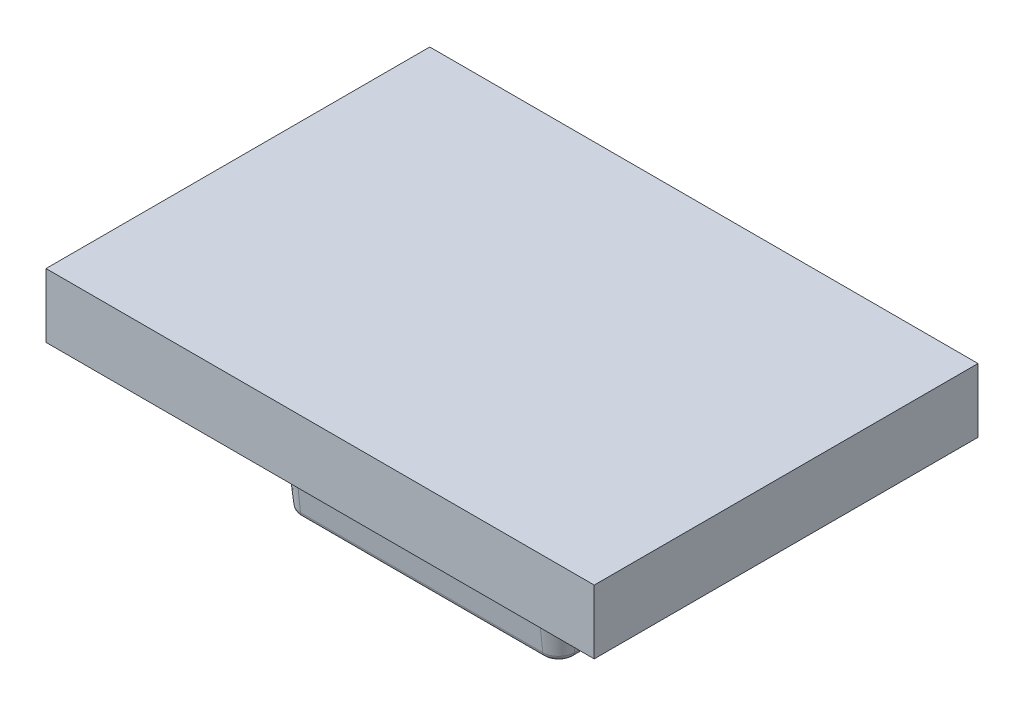
ISO-10303-21;
HEADER;
FILE_DESCRIPTION(('STEP AP214'),'2;1');
FILE_NAME('part.step','',(''),(''),'','','');
FILE_SCHEMA(('AUTOMOTIVE_DESIGN { 1 0 10303 214 1 1 1 1 }'));
ENDSEC;
DATA;
#1=APPLICATION_CONTEXT('core data for automotive mechanical design processes');
#2=APPLICATION_PROTOCOL_DEFINITION('international standard','automotive_design',2000,#1);
#3=PRODUCT_CONTEXT('',#1,'mechanical');
#4=PRODUCT('Part','Part','',(#3));
#5=PRODUCT_RELATED_PRODUCT_CATEGORY('part','',(#4));
#6=PRODUCT_DEFINITION_FORMATION('','',#4);
#7=PRODUCT_DEFINITION_CONTEXT('part definition',#1,'design');
#8=PRODUCT_DEFINITION('design','',#6,#7);
#9=PRODUCT_DEFINITION_SHAPE('','',#8);
#10=(LENGTH_UNIT() NAMED_UNIT(*) SI_UNIT(.MILLI.,.METRE.));
#11=(NAMED_UNIT(*) PLANE_ANGLE_UNIT() SI_UNIT($,.RADIAN.));
#12=(NAMED_UNIT(*) SI_UNIT($,.STERADIAN.) SOLID_ANGLE_UNIT());
#13=UNCERTAINTY_MEASURE_WITH_UNIT(LENGTH_MEASURE(1.E-05),#10,'distance_accuracy_value','');
#14=(GEOMETRIC_REPRESENTATION_CONTEXT(3) GLOBAL_UNCERTAINTY_ASSIGNED_CONTEXT((#13)) GLOBAL_UNIT_ASSIGNED_CONTEXT((#10,
#11,#12)) REPRESENTATION_CONTEXT('',''));
#15=CARTESIAN_POINT('',(0.,0.,0.));
#16=DIRECTION('',(0.,0.,1.));
#17=DIRECTION('',(1.,0.,0.));
#18=AXIS2_PLACEMENT_3D('',#15,#16,#17);
#19=CARTESIAN_POINT('',(0.,105.801666725908,0.));
#20=DIRECTION('',(0.,-1.,0.));
#21=DIRECTION('',(0.,0.,-1.));
#22=AXIS2_PLACEMENT_3D('',#19,#20,#21);
#23=PLANE('',#22);
#24=DIRECTION('',(0.,0.,1.));
#25=VECTOR('',#24,1.);
#26=CARTESIAN_POINT('',(150.,105.801666725908,105.));
#27=LINE('',#26,#25);
#28=CARTESIAN_POINT('',(150.,105.801666725908,-105.));
#29=VERTEX_POINT('',#28);
#30=CARTESIAN_POINT('',(150.,105.801666725908,105.));
#31=VERTEX_POINT('',#30);
#32=EDGE_CURVE('E292',#29,#31,#27,.T.);
#33=ORIENTED_EDGE('',*,*,#32,.F.);
#34=DIRECTION('',(1.,0.,0.));
#35=VECTOR('',#34,1.);
#36=CARTESIAN_POINT('',(-150.,105.801666725908,-105.));
#37=LINE('',#36,#35);
#38=CARTESIAN_POINT('',(-150.,105.801666725908,-105.));
#39=VERTEX_POINT('',#38);
#40=EDGE_CURVE('E304',#39,#29,#37,.T.);
#41=ORIENTED_EDGE('',*,*,#40,.F.);
#42=DIRECTION('',(0.,0.,-1.));
#43=VECTOR('',#42,1.);
#44=CARTESIAN_POINT('',(-150.,105.801666725908,105.));
#45=LINE('',#44,#43);
#46=CARTESIAN_POINT('',(-150.,105.801666725908,105.));
#47=VERTEX_POINT('',#46);
#48=EDGE_CURVE('E300',#47,#39,#45,.T.);
#49=ORIENTED_EDGE('',*,*,#48,.F.);
#50=DIRECTION('',(-1.,0.,0.));
#51=VECTOR('',#50,1.);
#52=CARTESIAN_POINT('',(-150.,105.801666725908,105.));
#53=LINE('',#52,#51);
#54=EDGE_CURVE('E296',#31,#47,#53,.T.);
#55=ORIENTED_EDGE('',*,*,#54,.F.);
#56=EDGE_LOOP('',(#33,#41,#49,#55));
#57=FACE_BOUND('',#56,.T.);
#58=ADVANCED_FACE('F47',(#57),#23,.F.);
#59=CARTESIAN_POINT('',(-150.,105.801666725908,105.));
#60=DIRECTION('',(0.,0.,1.));
#61=DIRECTION('',(1.,0.,0.));
#62=AXIS2_PLACEMENT_3D('',#59,#60,#61);
#63=PLANE('',#62);
#64=DIRECTION('',(0.,-1.,0.));
#65=VECTOR('',#64,1.);
#66=CARTESIAN_POINT('',(-150.,105.801666725908,105.));
#67=LINE('',#66,#65);
#68=CARTESIAN_POINT('',(-150.,70.8016667259083,105.));
#69=VERTEX_POINT('',#68);
#70=EDGE_CURVE('E316',#47,#69,#67,.T.);
#71=ORIENTED_EDGE('',*,*,#70,.T.);
#72=DIRECTION('',(1.,0.,0.));
#73=VECTOR('',#72,1.);
#74=CARTESIAN_POINT('',(-150.,70.8016667259083,105.));
#75=LINE('',#74,#73);
#76=CARTESIAN_POINT('',(150.,70.8016667259083,105.));
#77=VERTEX_POINT('',#76);
#78=EDGE_CURVE('E51',#69,#77,#75,.T.);
#79=ORIENTED_EDGE('',*,*,#78,.T.);
#80=DIRECTION('',(0.,-1.,0.));
#81=VECTOR('',#80,1.);
#82=CARTESIAN_POINT('',(150.,105.801666725908,105.));
#83=LINE('',#82,#81);
#84=EDGE_CURVE('E308',#31,#77,#83,.T.);
#85=ORIENTED_EDGE('',*,*,#84,.F.);
#86=ORIENTED_EDGE('',*,*,#54,.T.);
#87=EDGE_LOOP('',(#71,#79,#85,#86));
#88=FACE_BOUND('',#87,.T.);
#89=ADVANCED_FACE('F333',(#88),#63,.T.);
#90=CARTESIAN_POINT('',(-150.,105.801666725908,105.));
#91=DIRECTION('',(-1.,0.,0.));
#92=DIRECTION('',(0.,0.,1.));
#93=AXIS2_PLACEMENT_3D('',#90,#91,#92);
#94=PLANE('',#93);
#95=DIRECTION('',(0.,-1.,0.));
#96=VECTOR('',#95,1.);
#97=CARTESIAN_POINT('',(-150.,105.801666725908,-105.));
#98=LINE('',#97,#96);
#99=CARTESIAN_POINT('',(-150.,70.8016667259083,-105.));
#100=VERTEX_POINT('',#99);
#101=EDGE_CURVE('E313',#39,#100,#98,.T.);
#102=ORIENTED_EDGE('',*,*,#101,.T.);
#103=DIRECTION('',(0.,0.,1.));
#104=VECTOR('',#103,1.);
#105=CARTESIAN_POINT('',(-150.,70.8016667259083,105.));
#106=LINE('',#105,#104);
#107=EDGE_CURVE('E135',#100,#69,#106,.T.);
#108=ORIENTED_EDGE('',*,*,#107,.T.);
#109=ORIENTED_EDGE('',*,*,#70,.F.);
#110=ORIENTED_EDGE('',*,*,#48,.T.);
#111=EDGE_LOOP('',(#102,#108,#109,#110));
#112=FACE_BOUND('',#111,.T.);
#113=ADVANCED_FACE('F527',(#112),#94,.T.);
#114=CARTESIAN_POINT('',(-150.,105.801666725908,-105.));
#115=DIRECTION('',(0.,0.,-1.));
#116=DIRECTION('',(-1.,0.,0.));
#117=AXIS2_PLACEMENT_3D('',#114,#115,#116);
#118=PLANE('',#117);
#119=DIRECTION('',(0.,-1.,0.));
#120=VECTOR('',#119,1.);
#121=CARTESIAN_POINT('',(150.,105.801666725908,-105.));
#122=LINE('',#121,#120);
#123=CARTESIAN_POINT('',(150.,70.8016667259083,-105.));
#124=VERTEX_POINT('',#123);
#125=EDGE_CURVE('E309',#29,#124,#122,.T.);
#126=ORIENTED_EDGE('',*,*,#125,.T.);
#127=DIRECTION('',(-1.,0.,0.));
#128=VECTOR('',#127,1.);
#129=CARTESIAN_POINT('',(-150.,70.8016667259083,-105.));
#130=LINE('',#129,#128);
#131=EDGE_CURVE('E284',#124,#100,#130,.T.);
#132=ORIENTED_EDGE('',*,*,#131,.T.);
#133=ORIENTED_EDGE('',*,*,#101,.F.);
#134=ORIENTED_EDGE('',*,*,#40,.T.);
#135=EDGE_LOOP('',(#126,#132,#133,#134));
#136=FACE_BOUND('',#135,.T.);
#137=ADVANCED_FACE('F531',(#136),#118,.T.);
#138=CARTESIAN_POINT('',(150.,105.801666725908,105.));
#139=DIRECTION('',(1.,0.,0.));
#140=DIRECTION('',(0.,0.,-1.));
#141=AXIS2_PLACEMENT_3D('',#138,#139,#140);
#142=PLANE('',#141);
#143=ORIENTED_EDGE('',*,*,#84,.T.);
#144=DIRECTION('',(0.,0.,-1.));
#145=VECTOR('',#144,1.);
#146=CARTESIAN_POINT('',(150.,70.8016667259083,105.));
#147=LINE('',#146,#145);
#148=EDGE_CURVE('E288',#77,#124,#147,.T.);
#149=ORIENTED_EDGE('',*,*,#148,.T.);
#150=ORIENTED_EDGE('',*,*,#125,.F.);
#151=ORIENTED_EDGE('',*,*,#32,.T.);
#152=EDGE_LOOP('',(#143,#149,#150,#151));
#153=FACE_BOUND('',#152,.T.);
#154=ADVANCED_FACE('F49',(#153),#142,.T.);
#155=CARTESIAN_POINT('',(0.,-5.09504755958672,-48.4761393935052));
#156=DIRECTION('',(0.,0.104528463267654,0.994521895368273));
#157=DIRECTION('',(0.,-0.994521895368273,0.104528463267654));
#158=AXIS2_PLACEMENT_3D('',#155,#156,#157);
#159=PLANE('',#158);
#160=DIRECTION('',(0.,0.994521895368273,-0.104528463267654));
#161=VECTOR('',#160,1.);
#162=CARTESIAN_POINT('',(66.2987316482915,-0.385095209025722,-48.9711753334487));
#163=LINE('',#162,#161);
#164=CARTESIAN_POINT('',(66.2987316482915,68.9749047909743,-56.2612050914761));
#165=VERTEX_POINT('',#164);
#166=CARTESIAN_POINT('',(66.2987316482915,4.18180962830924,-49.4511763739079));
#167=VERTEX_POINT('',#166);
#168=EDGE_CURVE('E188',#165,#167,#163,.F.);
#169=ORIENTED_EDGE('',*,*,#168,.T.);
#170=DIRECTION('',(1.,0.,0.));
#171=VECTOR('',#170,1.);
#172=CARTESIAN_POINT('',(-66.3012683517084,4.18180962830924,-49.4511763739079));
#173=LINE('',#172,#171);
#174=CARTESIAN_POINT('',(-66.3012683517084,4.18180962830924,-49.4511763739079));
#175=VERTEX_POINT('',#174);
#176=EDGE_CURVE('E192',#167,#175,#173,.F.);
#177=ORIENTED_EDGE('',*,*,#176,.T.);
#178=DIRECTION('',(0.,0.994521895368273,-0.104528463267654));
#179=VECTOR('',#178,1.);
#180=CARTESIAN_POINT('',(-66.3012683517084,-0.385095209025722,-48.9711753334487));
#181=LINE('',#180,#179);
#182=CARTESIAN_POINT('',(-66.3012683517084,68.9749047909743,-56.2612050914761));
#183=VERTEX_POINT('',#182);
#184=EDGE_CURVE('E210',#183,#175,#181,.F.);
#185=ORIENTED_EDGE('',*,*,#184,.F.);
#186=DIRECTION('',(-1.,0.,0.));
#187=VECTOR('',#186,1.);
#188=CARTESIAN_POINT('',(-66.3012683517084,68.9749047909743,-56.2612050914761));
#189=LINE('',#188,#187);
#190=EDGE_CURVE('E194',#165,#183,#189,.T.);
#191=ORIENTED_EDGE('',*,*,#190,.F.);
#192=EDGE_LOOP('',(#169,#177,#185,#191));
#193=FACE_BOUND('',#192,.T.);
#194=ADVANCED_FACE('F190',(#193),#159,.F.);
#195=CARTESIAN_POINT('',(-71.9092077257895,4.50166672590826,40.7999999999999));
#196=DIRECTION('',(0.,0.,1.));
#197=DIRECTION('',(1.,0.,0.));
#198=AXIS2_PLACEMENT_3D('',#195,#196,#197);
#199=CYLINDRICAL_SURFACE('',#198,3.06);
#200=CARTESIAN_POINT('',(-71.9092077257895,4.50166672590826,-40.7999999999999));
#201=DIRECTION('',(0.,0.,1.));
#202=DIRECTION('',(1.,0.,0.));
#203=AXIS2_PLACEMENT_3D('',#200,#201,#202);
#204=CIRCLE('',#203,3.06);
#205=CARTESIAN_POINT('',(-74.9524447256164,4.18180962830924,-40.7999999999999));
#206=VERTEX_POINT('',#205);
#207=CARTESIAN_POINT('',(-71.9092077257895,1.44166672590826,-40.7999999999999));
#208=VERTEX_POINT('',#207);
#209=EDGE_CURVE('E209',#206,#208,#204,.T.);
#210=ORIENTED_EDGE('',*,*,#209,.T.);
#211=DIRECTION('',(0.,0.,-1.));
#212=VECTOR('',#211,1.);
#213=CARTESIAN_POINT('',(-71.9092077257895,1.44166672590826,40.8));
#214=LINE('',#213,#212);
#215=CARTESIAN_POINT('',(-71.9092077257895,1.44166672590826,40.8));
#216=VERTEX_POINT('',#215);
#217=EDGE_CURVE('E262',#216,#208,#214,.T.);
#218=ORIENTED_EDGE('',*,*,#217,.F.);
#219=CARTESIAN_POINT('',(-71.9092077257895,4.50166672590826,40.8));
#220=DIRECTION('',(0.,0.,1.));
#221=DIRECTION('',(1.,0.,0.));
#222=AXIS2_PLACEMENT_3D('',#219,#220,#221);
#223=CIRCLE('',#222,3.06);
#224=CARTESIAN_POINT('',(-74.9524447256164,4.18180962830924,40.7999999999999));
#225=VERTEX_POINT('',#224);
#226=EDGE_CURVE('E267',#225,#216,#223,.T.);
#227=ORIENTED_EDGE('',*,*,#226,.F.);
#228=DIRECTION('',(0.,0.,1.));
#229=VECTOR('',#228,1.);
#230=CARTESIAN_POINT('',(-74.9524447256164,4.18180962830924,40.7999999999999));
#231=LINE('',#230,#229);
#232=EDGE_CURVE('E281',#206,#225,#231,.T.);
#233=ORIENTED_EDGE('',*,*,#232,.F.);
#234=EDGE_LOOP('',(#210,#218,#227,#233));
#235=FACE_BOUND('',#234,.T.);
#236=ADVANCED_FACE('F460',(#235),#199,.T.);
#237=CARTESIAN_POINT('',(-66.3012683517085,4.50166672590826,40.8));
#238=DIRECTION('',(0.,-1.,0.));
#239=DIRECTION('',(0.,0.,-1.));
#240=AXIS2_PLACEMENT_3D('',#237,#238,#239);
#241=TOROIDAL_SURFACE('',#240,5.60793937408101,3.06);
#242=ORIENTED_EDGE('',*,*,#226,.T.);
#243=CARTESIAN_POINT('',(-66.3012683517085,1.44166672590826,40.8));
#244=DIRECTION('',(0.,-1.,0.));
#245=DIRECTION('',(0.,0.,-1.));
#246=AXIS2_PLACEMENT_3D('',#243,#244,#245);
#247=CIRCLE('',#246,5.60793937408101);
#248=CARTESIAN_POINT('',(-66.3012683517084,1.44166672590826,46.407939374081));
#249=VERTEX_POINT('',#248);
#250=EDGE_CURVE('E253',#249,#216,#247,.T.);
#251=ORIENTED_EDGE('',*,*,#250,.F.);
#252=CARTESIAN_POINT('',(-66.3012683517084,4.50166672590826,46.407939374081));
#253=DIRECTION('',(1.,0.,0.));
#254=DIRECTION('',(0.,0.,-1.));
#255=AXIS2_PLACEMENT_3D('',#252,#253,#254);
#256=CIRCLE('',#255,3.06);
#257=CARTESIAN_POINT('',(-66.3012683517084,4.18180962830924,49.4511763739079));
#258=VERTEX_POINT('',#257);
#259=EDGE_CURVE('E271',#249,#258,#256,.F.);
#260=ORIENTED_EDGE('',*,*,#259,.T.);
#261=CARTESIAN_POINT('',(-66.3012683517085,4.18180962830924,40.8));
#262=DIRECTION('',(0.,1.,0.));
#263=DIRECTION('',(0.,0.,1.));
#264=AXIS2_PLACEMENT_3D('',#261,#262,#263);
#265=CIRCLE('',#264,8.65117637390793);
#266=EDGE_CURVE('E266',#225,#258,#265,.T.);
#267=ORIENTED_EDGE('',*,*,#266,.F.);
#268=EDGE_LOOP('',(#242,#251,#260,#267));
#269=FACE_BOUND('',#268,.T.);
#270=ADVANCED_FACE('F507',(#269),#241,.T.);
#271=CARTESIAN_POINT('',(66.2987316482916,4.50166672590826,40.8));
#272=DIRECTION('',(0.,-1.,0.));
#273=DIRECTION('',(0.,0.,-1.));
#274=AXIS2_PLACEMENT_3D('',#271,#272,#273);
#275=TOROIDAL_SURFACE('',#274,5.60793937408101,3.06);
#276=CARTESIAN_POINT('',(71.9066710223725,4.50166672590826,40.8));
#277=DIRECTION('',(0.,0.,-1.));
#278=DIRECTION('',(-1.,0.,0.));
#279=AXIS2_PLACEMENT_3D('',#276,#277,#278);
#280=CIRCLE('',#279,3.06);
#281=CARTESIAN_POINT('',(71.9066710223725,1.44166672590826,40.7999999999999));
#282=VERTEX_POINT('',#281);
#283=CARTESIAN_POINT('',(74.9499080221995,4.18180962830924,40.7999999999999));
#284=VERTEX_POINT('',#283);
#285=EDGE_CURVE('E248',#282,#284,#280,.F.);
#286=ORIENTED_EDGE('',*,*,#285,.T.);
#287=CARTESIAN_POINT('',(66.2987316482916,4.18180962830924,40.8));
#288=DIRECTION('',(0.,1.,0.));
#289=DIRECTION('',(0.,0.,1.));
#290=AXIS2_PLACEMENT_3D('',#287,#288,#289);
#291=CIRCLE('',#290,8.65117637390793);
#292=CARTESIAN_POINT('',(66.2987316482915,4.18180962830924,49.4511763739079));
#293=VERTEX_POINT('',#292);
#294=EDGE_CURVE('E257',#293,#284,#291,.T.);
#295=ORIENTED_EDGE('',*,*,#294,.F.);
#296=CARTESIAN_POINT('',(66.2987316482915,4.50166672590826,46.407939374081));
#297=DIRECTION('',(1.,0.,0.));
#298=DIRECTION('',(0.,0.,-1.));
#299=AXIS2_PLACEMENT_3D('',#296,#297,#298);
#300=CIRCLE('',#299,3.06);
#301=CARTESIAN_POINT('',(66.2987316482915,1.44166672590826,46.407939374081));
#302=VERTEX_POINT('',#301);
#303=EDGE_CURVE('E261',#302,#293,#300,.F.);
#304=ORIENTED_EDGE('',*,*,#303,.F.);
#305=CARTESIAN_POINT('',(66.2987316482916,1.44166672590826,40.8));
#306=DIRECTION('',(0.,-1.,0.));
#307=DIRECTION('',(0.,0.,-1.));
#308=AXIS2_PLACEMENT_3D('',#305,#306,#307);
#309=CIRCLE('',#308,5.60793937408101);
#310=EDGE_CURVE('E252',#282,#302,#309,.T.);
#311=ORIENTED_EDGE('',*,*,#310,.F.);
#312=EDGE_LOOP('',(#286,#295,#304,#311));
#313=FACE_BOUND('',#312,.T.);
#314=ADVANCED_FACE('F451',(#313),#275,.T.);
#315=CARTESIAN_POINT('',(-66.3012683517084,4.50166672590826,46.407939374081));
#316=DIRECTION('',(1.,0.,0.));
#317=DIRECTION('',(0.,0.,-1.));
#318=AXIS2_PLACEMENT_3D('',#315,#316,#317);
#319=CYLINDRICAL_SURFACE('',#318,3.06);
#320=ORIENTED_EDGE('',*,*,#303,.T.);
#321=DIRECTION('',(1.,0.,0.));
#322=VECTOR('',#321,1.);
#323=CARTESIAN_POINT('',(-66.3012683517084,4.18180962830924,49.4511763739079));
#324=LINE('',#323,#322);
#325=EDGE_CURVE('E247',#258,#293,#324,.T.);
#326=ORIENTED_EDGE('',*,*,#325,.F.);
#327=ORIENTED_EDGE('',*,*,#259,.F.);
#328=DIRECTION('',(1.,0.,0.));
#329=VECTOR('',#328,1.);
#330=CARTESIAN_POINT('',(-66.3012683517085,1.44166672590826,46.407939374081));
#331=LINE('',#330,#329);
#332=EDGE_CURVE('E254',#302,#249,#331,.F.);
#333=ORIENTED_EDGE('',*,*,#332,.F.);
#334=EDGE_LOOP('',(#320,#326,#327,#333));
#335=FACE_BOUND('',#334,.T.);
#336=ADVANCED_FACE('F504',(#335),#319,.T.);
#337=CARTESIAN_POINT('',(-66.3012683517085,1.44166672590826,40.8));
#338=DIRECTION('',(0.,-1.,0.));
#339=DIRECTION('',(0.,0.,-1.));
#340=AXIS2_PLACEMENT_3D('',#337,#338,#339);
#341=PLANE('',#340);
#342=ORIENTED_EDGE('',*,*,#332,.T.);
#343=ORIENTED_EDGE('',*,*,#250,.T.);
#344=ORIENTED_EDGE('',*,*,#217,.T.);
#345=CARTESIAN_POINT('',(-66.3012683517085,1.44166672590826,-40.8));
#346=DIRECTION('',(0.,-1.,0.));
#347=DIRECTION('',(0.,0.,-1.));
#348=AXIS2_PLACEMENT_3D('',#345,#346,#347);
#349=CIRCLE('',#348,5.60793937408101);
#350=CARTESIAN_POINT('',(-66.3012683517084,1.44166672590826,-46.407939374081));
#351=VERTEX_POINT('',#350);
#352=EDGE_CURVE('E233',#208,#351,#349,.T.);
#353=ORIENTED_EDGE('',*,*,#352,.T.);
#354=DIRECTION('',(1.,0.,0.));
#355=VECTOR('',#354,1.);
#356=CARTESIAN_POINT('',(-66.3012683517085,1.44166672590826,-46.407939374081));
#357=LINE('',#356,#355);
#358=CARTESIAN_POINT('',(66.2987316482915,1.44166672590826,-46.407939374081));
#359=VERTEX_POINT('',#358);
#360=EDGE_CURVE('E235',#351,#359,#357,.T.);
#361=ORIENTED_EDGE('',*,*,#360,.T.);
#362=CARTESIAN_POINT('',(66.2987316482916,1.44166672590826,-40.8));
#363=DIRECTION('',(0.,-1.,0.));
#364=DIRECTION('',(0.,0.,-1.));
#365=AXIS2_PLACEMENT_3D('',#362,#363,#364);
#366=CIRCLE('',#365,5.60793937408101);
#367=CARTESIAN_POINT('',(71.9066710223725,1.44166672590826,-40.8));
#368=VERTEX_POINT('',#367);
#369=EDGE_CURVE('E225',#359,#368,#366,.T.);
#370=ORIENTED_EDGE('',*,*,#369,.T.);
#371=DIRECTION('',(0.,0.,-1.));
#372=VECTOR('',#371,1.);
#373=CARTESIAN_POINT('',(71.9066710223725,1.44166672590826,40.8));
#374=LINE('',#373,#372);
#375=EDGE_CURVE('E244',#368,#282,#374,.F.);
#376=ORIENTED_EDGE('',*,*,#375,.T.);
#377=ORIENTED_EDGE('',*,*,#310,.T.);
#378=EDGE_LOOP('',(#342,#343,#344,#353,#361,#370,#376,#377));
#379=FACE_BOUND('',#378,.T.);
#380=ADVANCED_FACE('F453',(#379),#341,.T.);
#381=CARTESIAN_POINT('',(71.9066710223725,4.50166672590826,40.7999999999999));
#382=DIRECTION('',(0.,0.,-1.));
#383=DIRECTION('',(-1.,0.,0.));
#384=AXIS2_PLACEMENT_3D('',#381,#382,#383);
#385=CYLINDRICAL_SURFACE('',#384,3.06);
#386=CARTESIAN_POINT('',(71.9066710223725,4.50166672590826,-40.8));
#387=DIRECTION('',(0.,0.,-1.));
#388=DIRECTION('',(-1.,0.,0.));
#389=AXIS2_PLACEMENT_3D('',#386,#387,#388);
#390=CIRCLE('',#389,3.06);
#391=CARTESIAN_POINT('',(74.9499080221995,4.18180962830924,-40.7999999999999));
#392=VERTEX_POINT('',#391);
#393=EDGE_CURVE('E238',#368,#392,#390,.F.);
#394=ORIENTED_EDGE('',*,*,#393,.T.);
#395=DIRECTION('',(0.,0.,1.));
#396=VECTOR('',#395,1.);
#397=CARTESIAN_POINT('',(74.9499080221995,4.18180962830924,40.7999999999999));
#398=LINE('',#397,#396);
#399=EDGE_CURVE('E220',#284,#392,#398,.F.);
#400=ORIENTED_EDGE('',*,*,#399,.F.);
#401=ORIENTED_EDGE('',*,*,#285,.F.);
#402=ORIENTED_EDGE('',*,*,#375,.F.);
#403=EDGE_LOOP('',(#394,#400,#401,#402));
#404=FACE_BOUND('',#403,.T.);
#405=ADVANCED_FACE('F443',(#404),#385,.T.);
#406=CARTESIAN_POINT('',(66.2987316482916,4.50166672590826,-40.8));
#407=DIRECTION('',(0.,-1.,0.));
#408=DIRECTION('',(0.,0.,-1.));
#409=AXIS2_PLACEMENT_3D('',#406,#407,#408);
#410=TOROIDAL_SURFACE('',#409,5.60793937408101,3.06);
#411=ORIENTED_EDGE('',*,*,#393,.F.);
#412=ORIENTED_EDGE('',*,*,#369,.F.);
#413=CARTESIAN_POINT('',(66.2987316482915,4.50166672590826,-46.407939374081));
#414=DIRECTION('',(-1.,0.,0.));
#415=DIRECTION('',(0.,0.,1.));
#416=AXIS2_PLACEMENT_3D('',#413,#414,#415);
#417=CIRCLE('',#416,3.06);
#418=EDGE_CURVE('E205',#167,#359,#417,.T.);
#419=ORIENTED_EDGE('',*,*,#418,.F.);
#420=CARTESIAN_POINT('',(66.2987316482916,4.18180962830924,-40.8));
#421=DIRECTION('',(0.,1.,0.));
#422=DIRECTION('',(0.,0.,1.));
#423=AXIS2_PLACEMENT_3D('',#420,#421,#422);
#424=CIRCLE('',#423,8.65117637390793);
#425=EDGE_CURVE('E213',#392,#167,#424,.T.);
#426=ORIENTED_EDGE('',*,*,#425,.F.);
#427=EDGE_LOOP('',(#411,#412,#419,#426));
#428=FACE_BOUND('',#427,.T.);
#429=ADVANCED_FACE('F223',(#428),#410,.T.);
#430=CARTESIAN_POINT('',(-66.3012683517084,4.50166672590826,-46.407939374081));
#431=DIRECTION('',(-1.,0.,0.));
#432=DIRECTION('',(0.,0.,1.));
#433=AXIS2_PLACEMENT_3D('',#430,#431,#432);
#434=CYLINDRICAL_SURFACE('',#433,3.06);
#435=ORIENTED_EDGE('',*,*,#418,.T.);
#436=ORIENTED_EDGE('',*,*,#360,.F.);
#437=CARTESIAN_POINT('',(-66.3012683517084,4.50166672590826,-46.407939374081));
#438=DIRECTION('',(-1.,0.,0.));
#439=DIRECTION('',(0.,0.,1.));
#440=AXIS2_PLACEMENT_3D('',#437,#438,#439);
#441=CIRCLE('',#440,3.06);
#442=EDGE_CURVE('E207',#175,#351,#441,.T.);
#443=ORIENTED_EDGE('',*,*,#442,.F.);
#444=ORIENTED_EDGE('',*,*,#176,.F.);
#445=EDGE_LOOP('',(#435,#436,#443,#444));
#446=FACE_BOUND('',#445,.T.);
#447=ADVANCED_FACE('F202',(#446),#434,.T.);
#448=CARTESIAN_POINT('',(-66.3012683517085,4.50166672590826,-40.8));
#449=DIRECTION('',(0.,-1.,0.));
#450=DIRECTION('',(0.,0.,-1.));
#451=AXIS2_PLACEMENT_3D('',#448,#449,#450);
#452=TOROIDAL_SURFACE('',#451,5.60793937408101,3.06);
#453=ORIENTED_EDGE('',*,*,#442,.T.);
#454=ORIENTED_EDGE('',*,*,#352,.F.);
#455=ORIENTED_EDGE('',*,*,#209,.F.);
#456=CARTESIAN_POINT('',(-66.3012683517085,4.18180962830924,-40.8));
#457=DIRECTION('',(0.,1.,0.));
#458=DIRECTION('',(0.,0.,1.));
#459=AXIS2_PLACEMENT_3D('',#456,#457,#458);
#460=CIRCLE('',#459,8.65117637390793);
#461=EDGE_CURVE('E229',#175,#206,#460,.T.);
#462=ORIENTED_EDGE('',*,*,#461,.F.);
#463=EDGE_LOOP('',(#453,#454,#455,#462));
#464=FACE_BOUND('',#463,.T.);
#465=ADVANCED_FACE('F457',(#464),#452,.T.);
#466=CARTESIAN_POINT('',(-66.3012683517085,-0.385095209025722,-40.8));
#467=DIRECTION('',(0.,1.,0.));
#468=DIRECTION('',(0.,0.,-1.));
#469=AXIS2_PLACEMENT_3D('',#466,#467,#468);
#470=CONICAL_SURFACE('',#469,8.17117533344872,0.10471975511966);
#471=ORIENTED_EDGE('',*,*,#184,.T.);
#472=ORIENTED_EDGE('',*,*,#461,.T.);
#473=DIRECTION('',(0.104528463267654,-0.994521895368273,0.));
#474=VECTOR('',#473,1.);
#475=CARTESIAN_POINT('',(-74.4724436851572,-0.385095209025722,-40.7999999999999));
#476=LINE('',#475,#474);
#477=CARTESIAN_POINT('',(-81.7624734431845,68.9749047909743,-40.7999999999999));
#478=VERTEX_POINT('',#477);
#479=EDGE_CURVE('E375',#478,#206,#476,.T.);
#480=ORIENTED_EDGE('',*,*,#479,.F.);
#481=CARTESIAN_POINT('',(-66.3012683517085,68.9749047909743,-40.8));
#482=DIRECTION('',(0.,1.,0.));
#483=DIRECTION('',(0.,0.,1.));
#484=AXIS2_PLACEMENT_3D('',#481,#482,#483);
#485=CIRCLE('',#484,15.4612050914761);
#486=EDGE_CURVE('E121',#183,#478,#485,.T.);
#487=ORIENTED_EDGE('',*,*,#486,.F.);
#488=EDGE_LOOP('',(#471,#472,#480,#487));
#489=FACE_BOUND('',#488,.T.);
#490=ADVANCED_FACE('F465',(#489),#470,.T.);
#491=CARTESIAN_POINT('',(-74.4724436851572,-0.385095209025722,40.7999999999999));
#492=DIRECTION('',(-0.994521895368273,-0.104528463267654,0.));
#493=DIRECTION('',(0.104528463267654,-0.994521895368273,0.));
#494=AXIS2_PLACEMENT_3D('',#491,#492,#493);
#495=PLANE('',#494);
#496=ORIENTED_EDGE('',*,*,#479,.T.);
#497=ORIENTED_EDGE('',*,*,#232,.T.);
#498=DIRECTION('',(-0.104528463267654,0.994521895368273,0.));
#499=VECTOR('',#498,1.);
#500=CARTESIAN_POINT('',(-74.4724436851572,-0.385095209025722,40.7999999999999));
#501=LINE('',#500,#499);
#502=CARTESIAN_POINT('',(-81.7624734431845,68.9749047909743,40.7999999999999));
#503=VERTEX_POINT('',#502);
#504=EDGE_CURVE('E371',#503,#225,#501,.F.);
#505=ORIENTED_EDGE('',*,*,#504,.F.);
#506=DIRECTION('',(0.,0.,1.));
#507=VECTOR('',#506,1.);
#508=CARTESIAN_POINT('',(-81.7624734431845,68.9749047909743,40.7999999999999));
#509=LINE('',#508,#507);
#510=EDGE_CURVE('E373',#478,#503,#509,.T.);
#511=ORIENTED_EDGE('',*,*,#510,.F.);
#512=EDGE_LOOP('',(#496,#497,#505,#511));
#513=FACE_BOUND('',#512,.T.);
#514=ADVANCED_FACE('F464',(#513),#495,.T.);
#515=CARTESIAN_POINT('',(-66.3012683517085,-0.385095209025722,40.8));
#516=DIRECTION('',(0.,1.,0.));
#517=DIRECTION('',(0.,0.,-1.));
#518=AXIS2_PLACEMENT_3D('',#515,#516,#517);
#519=CONICAL_SURFACE('',#518,8.17117533344872,0.10471975511966);
#520=ORIENTED_EDGE('',*,*,#504,.T.);
#521=ORIENTED_EDGE('',*,*,#266,.T.);
#522=DIRECTION('',(0.,-0.994521895368273,-0.104528463267654));
#523=VECTOR('',#522,1.);
#524=CARTESIAN_POINT('',(-66.3012683517084,-0.385095209025722,48.9711753334487));
#525=LINE('',#524,#523);
#526=CARTESIAN_POINT('',(-66.3012683517084,68.9749047909743,56.2612050914761));
#527=VERTEX_POINT('',#526);
#528=EDGE_CURVE('E367',#527,#258,#525,.T.);
#529=ORIENTED_EDGE('',*,*,#528,.F.);
#530=CARTESIAN_POINT('',(-66.3012683517085,68.9749047909743,40.8));
#531=DIRECTION('',(0.,1.,0.));
#532=DIRECTION('',(0.,0.,1.));
#533=AXIS2_PLACEMENT_3D('',#530,#531,#532);
#534=CIRCLE('',#533,15.4612050914761);
#535=EDGE_CURVE('E369',#503,#527,#534,.T.);
#536=ORIENTED_EDGE('',*,*,#535,.F.);
#537=EDGE_LOOP('',(#520,#521,#529,#536));
#538=FACE_BOUND('',#537,.T.);
#539=ADVANCED_FACE('F509',(#538),#519,.T.);
#540=CARTESIAN_POINT('',(-66.3012683517084,-0.385095209025722,48.9711753334487));
#541=DIRECTION('',(0.,-0.104528463267654,0.994521895368273));
#542=DIRECTION('',(0.,-0.994521895368273,-0.104528463267654));
#543=AXIS2_PLACEMENT_3D('',#540,#541,#542);
#544=PLANE('',#543);
#545=ORIENTED_EDGE('',*,*,#528,.T.);
#546=ORIENTED_EDGE('',*,*,#325,.T.);
#547=DIRECTION('',(0.,0.994521895368273,0.104528463267654));
#548=VECTOR('',#547,1.);
#549=CARTESIAN_POINT('',(66.2987316482915,-0.385095209025722,48.9711753334487));
#550=LINE('',#549,#548);
#551=CARTESIAN_POINT('',(66.2987316482914,68.9749047909743,56.2612050914761));
#552=VERTEX_POINT('',#551);
#553=EDGE_CURVE('E362',#552,#293,#550,.F.);
#554=ORIENTED_EDGE('',*,*,#553,.F.);
#555=DIRECTION('',(1.,0.,0.));
#556=VECTOR('',#555,1.);
#557=CARTESIAN_POINT('',(66.2987316482915,68.9749047909743,56.2612050914761));
#558=LINE('',#557,#556);
#559=EDGE_CURVE('E365',#527,#552,#558,.T.);
#560=ORIENTED_EDGE('',*,*,#559,.F.);
#561=EDGE_LOOP('',(#545,#546,#554,#560));
#562=FACE_BOUND('',#561,.T.);
#563=ADVANCED_FACE('F499',(#562),#544,.T.);
#564=CARTESIAN_POINT('',(66.2987316482916,-0.385095209025722,40.8));
#565=DIRECTION('',(0.,1.,0.));
#566=DIRECTION('',(0.,0.,1.));
#567=AXIS2_PLACEMENT_3D('',#564,#565,#566);
#568=CONICAL_SURFACE('',#567,8.17117533344872,0.10471975511966);
#569=ORIENTED_EDGE('',*,*,#553,.T.);
#570=ORIENTED_EDGE('',*,*,#294,.T.);
#571=DIRECTION('',(0.104528463267654,0.994521895368273,0.));
#572=VECTOR('',#571,1.);
#573=CARTESIAN_POINT('',(74.4699069817403,-0.385095209025722,40.7999999999999));
#574=LINE('',#573,#572);
#575=CARTESIAN_POINT('',(81.7599367397676,68.9749047909743,40.7999999999999));
#576=VERTEX_POINT('',#575);
#577=EDGE_CURVE('E361',#576,#284,#574,.F.);
#578=ORIENTED_EDGE('',*,*,#577,.F.);
#579=CARTESIAN_POINT('',(66.2987316482916,68.9749047909743,40.8));
#580=DIRECTION('',(0.,1.,0.));
#581=DIRECTION('',(0.,0.,1.));
#582=AXIS2_PLACEMENT_3D('',#579,#580,#581);
#583=CIRCLE('',#582,15.4612050914761);
#584=EDGE_CURVE('E364',#552,#576,#583,.T.);
#585=ORIENTED_EDGE('',*,*,#584,.F.);
#586=EDGE_LOOP('',(#569,#570,#578,#585));
#587=FACE_BOUND('',#586,.T.);
#588=ADVANCED_FACE('F447',(#587),#568,.T.);
#589=CARTESIAN_POINT('',(74.4699069817403,-0.385095209025722,40.7999999999999));
#590=DIRECTION('',(0.994521895368273,-0.104528463267654,0.));
#591=DIRECTION('',(0.104528463267654,0.994521895368273,0.));
#592=AXIS2_PLACEMENT_3D('',#589,#590,#591);
#593=PLANE('',#592);
#594=ORIENTED_EDGE('',*,*,#577,.T.);
#595=ORIENTED_EDGE('',*,*,#399,.T.);
#596=DIRECTION('',(0.104528463267654,0.994521895368273,0.));
#597=VECTOR('',#596,1.);
#598=CARTESIAN_POINT('',(74.4699069817403,-0.385095209025722,-40.7999999999999));
#599=LINE('',#598,#597);
#600=CARTESIAN_POINT('',(81.7599367397676,68.9749047909743,-40.7999999999999));
#601=VERTEX_POINT('',#600);
#602=EDGE_CURVE('E216',#601,#392,#599,.F.);
#603=ORIENTED_EDGE('',*,*,#602,.F.);
#604=DIRECTION('',(0.,0.,-1.));
#605=VECTOR('',#604,1.);
#606=CARTESIAN_POINT('',(81.7599367397676,68.9749047909743,-40.7999999999999));
#607=LINE('',#606,#605);
#608=EDGE_CURVE('E426',#576,#601,#607,.T.);
#609=ORIENTED_EDGE('',*,*,#608,.F.);
#610=EDGE_LOOP('',(#594,#595,#603,#609));
#611=FACE_BOUND('',#610,.T.);
#612=ADVANCED_FACE('F438',(#611),#593,.T.);
#613=CARTESIAN_POINT('',(66.2987316482916,-0.385095209025722,-40.8));
#614=DIRECTION('',(0.,1.,0.));
#615=DIRECTION('',(0.,0.,-1.));
#616=AXIS2_PLACEMENT_3D('',#613,#614,#615);
#617=CONICAL_SURFACE('',#616,8.17117533344872,0.10471975511966);
#618=ORIENTED_EDGE('',*,*,#602,.T.);
#619=ORIENTED_EDGE('',*,*,#425,.T.);
#620=ORIENTED_EDGE('',*,*,#168,.F.);
#621=CARTESIAN_POINT('',(66.2987316482916,68.9749047909743,-40.8));
#622=DIRECTION('',(0.,1.,0.));
#623=DIRECTION('',(0.,0.,1.));
#624=AXIS2_PLACEMENT_3D('',#621,#622,#623);
#625=CIRCLE('',#624,15.4612050914761);
#626=EDGE_CURVE('E431',#601,#165,#625,.T.);
#627=ORIENTED_EDGE('',*,*,#626,.F.);
#628=EDGE_LOOP('',(#618,#619,#620,#627));
#629=FACE_BOUND('',#628,.T.);
#630=ADVANCED_FACE('F214',(#629),#617,.T.);
#631=CARTESIAN_POINT('',(-66.3012683517084,68.7616667259083,-58.2900297580273));
#632=DIRECTION('',(-1.,0.,0.));
#633=DIRECTION('',(0.,0.,1.));
#634=AXIS2_PLACEMENT_3D('',#631,#632,#633);
#635=CYLINDRICAL_SURFACE('',#634,2.04);
#636=CARTESIAN_POINT('',(66.2987316482915,68.7616667259083,-58.2900297580273));
#637=DIRECTION('',(-1.,0.,0.));
#638=DIRECTION('',(0.,-1.,0.));
#639=AXIS2_PLACEMENT_3D('',#636,#637,#638);
#640=CIRCLE('',#639,2.04);
#641=CARTESIAN_POINT('',(66.2987316482915,70.8016667259083,-58.2900297580273));
#642=VERTEX_POINT('',#641);
#643=EDGE_CURVE('E127',#165,#642,#640,.T.);
#644=ORIENTED_EDGE('',*,*,#643,.F.);
#645=ORIENTED_EDGE('',*,*,#190,.T.);
#646=CARTESIAN_POINT('',(-66.3012683517084,68.7616667259083,-58.2900297580273));
#647=DIRECTION('',(1.,0.,0.));
#648=DIRECTION('',(0.,0.,-1.));
#649=AXIS2_PLACEMENT_3D('',#646,#647,#648);
#650=CIRCLE('',#649,2.04);
#651=CARTESIAN_POINT('',(-66.3012683517084,70.8016667259083,-58.2900297580273));
#652=VERTEX_POINT('',#651);
#653=EDGE_CURVE('E390',#652,#183,#650,.T.);
#654=ORIENTED_EDGE('',*,*,#653,.F.);
#655=DIRECTION('',(1.,0.,0.));
#656=VECTOR('',#655,1.);
#657=CARTESIAN_POINT('',(66.2987316482915,70.8016667259083,-58.2900297580273));
#658=LINE('',#657,#656);
#659=EDGE_CURVE('E90',#652,#642,#658,.T.);
#660=ORIENTED_EDGE('',*,*,#659,.T.);
#661=EDGE_LOOP('',(#644,#645,#654,#660));
#662=FACE_BOUND('',#661,.T.);
#663=ADVANCED_FACE('F675',(#662),#635,.F.);
#664=CARTESIAN_POINT('',(66.2987316482916,68.7616667259083,-40.8));
#665=DIRECTION('',(0.,-1.,0.));
#666=DIRECTION('',(0.,0.,-1.));
#667=AXIS2_PLACEMENT_3D('',#664,#665,#666);
#668=TOROIDAL_SURFACE('',#667,17.4900297580273,2.04);
#669=CARTESIAN_POINT('',(83.7887614063189,68.7616667259083,-40.7999999999999));
#670=DIRECTION('',(0.,0.,-1.));
#671=DIRECTION('',(0.,1.,0.));
#672=AXIS2_PLACEMENT_3D('',#669,#670,#671);
#673=CIRCLE('',#672,2.04);
#674=CARTESIAN_POINT('',(83.7887614063189,70.8016667259083,-40.7999999999999));
#675=VERTEX_POINT('',#674);
#676=EDGE_CURVE('E98',#601,#675,#673,.T.);
#677=ORIENTED_EDGE('',*,*,#676,.F.);
#678=ORIENTED_EDGE('',*,*,#626,.T.);
#679=ORIENTED_EDGE('',*,*,#643,.T.);
#680=CARTESIAN_POINT('',(66.2987316482916,70.8016667259083,-40.8));
#681=DIRECTION('',(0.,-1.,0.));
#682=DIRECTION('',(0.,0.,-1.));
#683=AXIS2_PLACEMENT_3D('',#680,#681,#682);
#684=CIRCLE('',#683,17.4900297580273);
#685=EDGE_CURVE('E420',#642,#675,#684,.T.);
#686=ORIENTED_EDGE('',*,*,#685,.T.);
#687=EDGE_LOOP('',(#677,#678,#679,#686));
#688=FACE_BOUND('',#687,.T.);
#689=ADVANCED_FACE('F489',(#688),#668,.F.);
#690=CARTESIAN_POINT('',(83.7887614063189,68.7616667259083,40.7999999999999));
#691=DIRECTION('',(0.,0.,-1.));
#692=DIRECTION('',(-1.,0.,0.));
#693=AXIS2_PLACEMENT_3D('',#690,#691,#692);
#694=CYLINDRICAL_SURFACE('',#693,2.04);
#695=CARTESIAN_POINT('',(83.7887614063189,68.7616667259083,40.7999999999999));
#696=DIRECTION('',(0.,0.,-1.));
#697=DIRECTION('',(0.,1.,0.));
#698=AXIS2_PLACEMENT_3D('',#695,#696,#697);
#699=CIRCLE('',#698,2.04);
#700=CARTESIAN_POINT('',(83.7887614063189,70.8016667259083,40.7999999999999));
#701=VERTEX_POINT('',#700);
#702=EDGE_CURVE('E416',#576,#701,#699,.T.);
#703=ORIENTED_EDGE('',*,*,#702,.F.);
#704=ORIENTED_EDGE('',*,*,#608,.T.);
#705=ORIENTED_EDGE('',*,*,#676,.T.);
#706=DIRECTION('',(0.,0.,1.));
#707=VECTOR('',#706,1.);
#708=CARTESIAN_POINT('',(83.7887614063189,70.8016667259083,40.7999999999999));
#709=LINE('',#708,#707);
#710=EDGE_CURVE('E412',#675,#701,#709,.T.);
#711=ORIENTED_EDGE('',*,*,#710,.T.);
#712=EDGE_LOOP('',(#703,#704,#705,#711));
#713=FACE_BOUND('',#712,.T.);
#714=ADVANCED_FACE('F494',(#713),#694,.F.);
#715=CARTESIAN_POINT('',(66.2987316482916,68.7616667259083,40.8));
#716=DIRECTION('',(0.,-1.,0.));
#717=DIRECTION('',(0.,0.,-1.));
#718=AXIS2_PLACEMENT_3D('',#715,#716,#717);
#719=TOROIDAL_SURFACE('',#718,17.4900297580273,2.04);
#720=CARTESIAN_POINT('',(66.2987316482914,68.7616667259083,58.2900297580273));
#721=DIRECTION('',(1.,0.,0.));
#722=DIRECTION('',(0.,1.,0.));
#723=AXIS2_PLACEMENT_3D('',#720,#721,#722);
#724=CIRCLE('',#723,2.04);
#725=CARTESIAN_POINT('',(66.2987316482914,70.8016667259083,58.2900297580273));
#726=VERTEX_POINT('',#725);
#727=EDGE_CURVE('E408',#552,#726,#724,.T.);
#728=ORIENTED_EDGE('',*,*,#727,.F.);
#729=ORIENTED_EDGE('',*,*,#584,.T.);
#730=ORIENTED_EDGE('',*,*,#702,.T.);
#731=CARTESIAN_POINT('',(66.2987316482916,70.8016667259083,40.8));
#732=DIRECTION('',(0.,-1.,0.));
#733=DIRECTION('',(0.,0.,-1.));
#734=AXIS2_PLACEMENT_3D('',#731,#732,#733);
#735=CIRCLE('',#734,17.4900297580273);
#736=EDGE_CURVE('E404',#701,#726,#735,.T.);
#737=ORIENTED_EDGE('',*,*,#736,.T.);
#738=EDGE_LOOP('',(#728,#729,#730,#737));
#739=FACE_BOUND('',#738,.T.);
#740=ADVANCED_FACE('F496',(#739),#719,.F.);
#741=CARTESIAN_POINT('',(-66.3012683517084,68.7616667259083,58.2900297580273));
#742=DIRECTION('',(1.,0.,0.));
#743=DIRECTION('',(0.,0.,-1.));
#744=AXIS2_PLACEMENT_3D('',#741,#742,#743);
#745=CYLINDRICAL_SURFACE('',#744,2.04);
#746=CARTESIAN_POINT('',(-66.3012683517084,68.7616667259083,58.2900297580273));
#747=DIRECTION('',(-1.,0.,0.));
#748=DIRECTION('',(0.,0.,1.));
#749=AXIS2_PLACEMENT_3D('',#746,#747,#748);
#750=CIRCLE('',#749,2.04);
#751=CARTESIAN_POINT('',(-66.3012683517084,70.8016667259083,58.2900297580273));
#752=VERTEX_POINT('',#751);
#753=EDGE_CURVE('E401',#752,#527,#750,.T.);
#754=ORIENTED_EDGE('',*,*,#753,.T.);
#755=ORIENTED_EDGE('',*,*,#559,.T.);
#756=ORIENTED_EDGE('',*,*,#727,.T.);
#757=DIRECTION('',(-1.,0.,0.));
#758=VECTOR('',#757,1.);
#759=CARTESIAN_POINT('',(-66.3012683517084,70.8016667259083,58.2900297580273));
#760=LINE('',#759,#758);
#761=EDGE_CURVE('E397',#726,#752,#760,.T.);
#762=ORIENTED_EDGE('',*,*,#761,.T.);
#763=EDGE_LOOP('',(#754,#755,#756,#762));
#764=FACE_BOUND('',#763,.T.);
#765=ADVANCED_FACE('F512',(#764),#745,.F.);
#766=CARTESIAN_POINT('',(-66.3012683517085,68.7616667259083,40.8));
#767=DIRECTION('',(0.,-1.,0.));
#768=DIRECTION('',(0.,0.,-1.));
#769=AXIS2_PLACEMENT_3D('',#766,#767,#768);
#770=TOROIDAL_SURFACE('',#769,17.4900297580273,2.04);
#771=ORIENTED_EDGE('',*,*,#753,.F.);
#772=CARTESIAN_POINT('',(-66.3012683517085,70.8016667259083,40.8));
#773=DIRECTION('',(0.,-1.,0.));
#774=DIRECTION('',(0.,0.,-1.));
#775=AXIS2_PLACEMENT_3D('',#772,#773,#774);
#776=CIRCLE('',#775,17.4900297580273);
#777=CARTESIAN_POINT('',(-83.7912981097358,70.8016667259083,40.7999999999999));
#778=VERTEX_POINT('',#777);
#779=EDGE_CURVE('E396',#752,#778,#776,.T.);
#780=ORIENTED_EDGE('',*,*,#779,.T.);
#781=CARTESIAN_POINT('',(-83.7912981097358,68.7616667259083,40.7999999999999));
#782=DIRECTION('',(0.,0.,-1.));
#783=DIRECTION('',(-1.,0.,0.));
#784=AXIS2_PLACEMENT_3D('',#781,#782,#783);
#785=CIRCLE('',#784,2.04);
#786=EDGE_CURVE('E393',#778,#503,#785,.T.);
#787=ORIENTED_EDGE('',*,*,#786,.T.);
#788=ORIENTED_EDGE('',*,*,#535,.T.);
#789=EDGE_LOOP('',(#771,#780,#787,#788));
#790=FACE_BOUND('',#789,.T.);
#791=ADVANCED_FACE('F510',(#790),#770,.F.);
#792=CARTESIAN_POINT('',(-83.7912981097358,68.7616667259083,40.7999999999999));
#793=DIRECTION('',(0.,0.,1.));
#794=DIRECTION('',(1.,0.,0.));
#795=AXIS2_PLACEMENT_3D('',#792,#793,#794);
#796=CYLINDRICAL_SURFACE('',#795,2.04);
#797=ORIENTED_EDGE('',*,*,#786,.F.);
#798=DIRECTION('',(0.,0.,-1.));
#799=VECTOR('',#798,1.);
#800=CARTESIAN_POINT('',(-83.7912981097358,70.8016667259083,-40.7999999999999));
#801=LINE('',#800,#799);
#802=CARTESIAN_POINT('',(-83.7912981097358,70.8016667259083,-40.7999999999999));
#803=VERTEX_POINT('',#802);
#804=EDGE_CURVE('E58',#778,#803,#801,.T.);
#805=ORIENTED_EDGE('',*,*,#804,.T.);
#806=CARTESIAN_POINT('',(-83.7912981097358,68.7616667259083,-40.7999999999999));
#807=DIRECTION('',(0.,0.,-1.));
#808=DIRECTION('',(-1.,0.,0.));
#809=AXIS2_PLACEMENT_3D('',#806,#807,#808);
#810=CIRCLE('',#809,2.04);
#811=EDGE_CURVE('E388',#803,#478,#810,.T.);
#812=ORIENTED_EDGE('',*,*,#811,.T.);
#813=ORIENTED_EDGE('',*,*,#510,.T.);
#814=EDGE_LOOP('',(#797,#805,#812,#813));
#815=FACE_BOUND('',#814,.T.);
#816=ADVANCED_FACE('F469',(#815),#796,.F.);
#817=CARTESIAN_POINT('',(-66.3012683517085,68.7616667259083,-40.8));
#818=DIRECTION('',(0.,-1.,0.));
#819=DIRECTION('',(0.,0.,-1.));
#820=AXIS2_PLACEMENT_3D('',#817,#818,#819);
#821=TOROIDAL_SURFACE('',#820,17.4900297580273,2.04);
#822=ORIENTED_EDGE('',*,*,#811,.F.);
#823=CARTESIAN_POINT('',(-66.3012683517085,70.8016667259083,-40.8));
#824=DIRECTION('',(0.,-1.,0.));
#825=DIRECTION('',(0.,0.,-1.));
#826=AXIS2_PLACEMENT_3D('',#823,#824,#825);
#827=CIRCLE('',#826,17.4900297580273);
#828=EDGE_CURVE('E11',#803,#652,#827,.T.);
#829=ORIENTED_EDGE('',*,*,#828,.T.);
#830=ORIENTED_EDGE('',*,*,#653,.T.);
#831=ORIENTED_EDGE('',*,*,#486,.T.);
#832=EDGE_LOOP('',(#822,#829,#830,#831));
#833=FACE_BOUND('',#832,.T.);
#834=ADVANCED_FACE('F549',(#833),#821,.F.);
#835=CARTESIAN_POINT('',(-66.3012683517085,70.8016667259083,40.8));
#836=DIRECTION('',(0.,-1.,0.));
#837=DIRECTION('',(0.,0.,-1.));
#838=AXIS2_PLACEMENT_3D('',#835,#836,#837);
#839=PLANE('',#838);
#840=ORIENTED_EDGE('',*,*,#828,.F.);
#841=ORIENTED_EDGE('',*,*,#804,.F.);
#842=ORIENTED_EDGE('',*,*,#779,.F.);
#843=ORIENTED_EDGE('',*,*,#761,.F.);
#844=ORIENTED_EDGE('',*,*,#736,.F.);
#845=ORIENTED_EDGE('',*,*,#710,.F.);
#846=ORIENTED_EDGE('',*,*,#685,.F.);
#847=ORIENTED_EDGE('',*,*,#659,.F.);
#848=EDGE_LOOP('',(#840,#841,#842,#843,#844,#845,#846,#847));
#849=FACE_BOUND('',#848,.T.);
#850=ORIENTED_EDGE('',*,*,#78,.F.);
#851=ORIENTED_EDGE('',*,*,#107,.F.);
#852=ORIENTED_EDGE('',*,*,#131,.F.);
#853=ORIENTED_EDGE('',*,*,#148,.F.);
#854=EDGE_LOOP('',(#850,#851,#852,#853));
#855=FACE_BOUND('',#854,.T.);
#856=ADVANCED_FACE('F491',(#849,#855),#839,.T.);
#857=CLOSED_SHELL('',(#58,#89,#113,#137,#154,#194,#236,#270,#314,#336,#380,#405,#429,#447,#465,
#490,#514,#539,#563,#588,#612,#630,#663,#689,#714,#740,#765,#791,#816,#834,#856));
#858=MANIFOLD_SOLID_BREP('B2',#857);
#859=ADVANCED_BREP_SHAPE_REPRESENTATION('',(#18,#858),#14);
#860=SHAPE_DEFINITION_REPRESENTATION(#9,#859);
ENDSEC;
END-ISO-10303-21;
